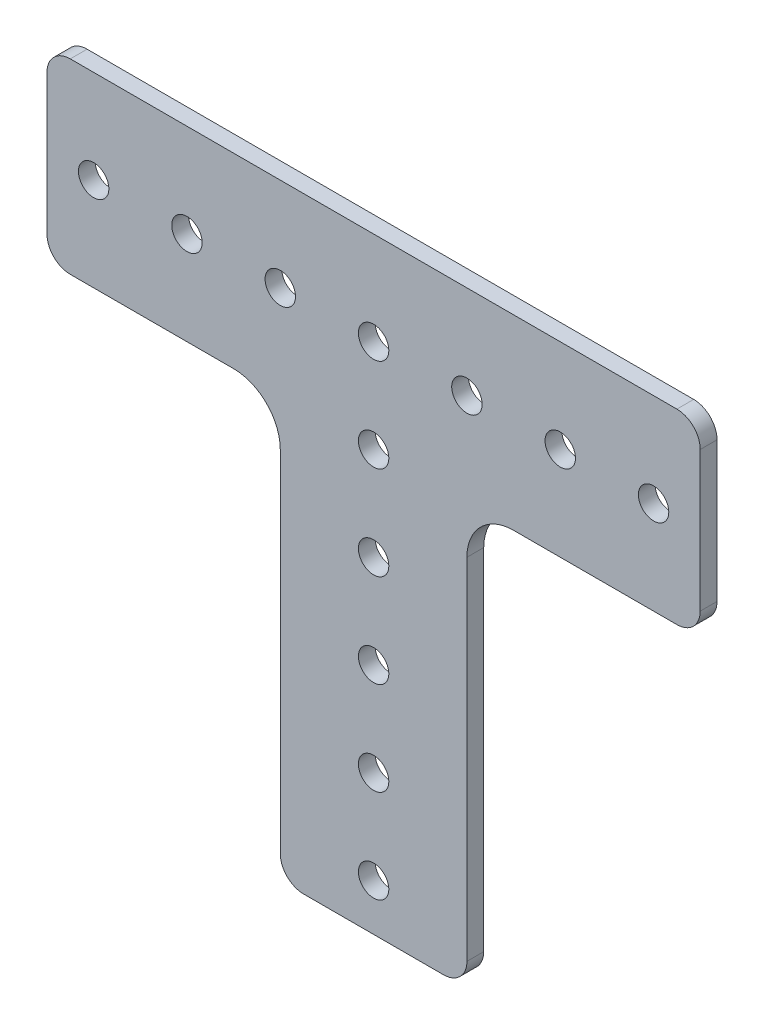
ISO-10303-21;
HEADER;
FILE_DESCRIPTION(('STEP AP214'),'2;1');
FILE_NAME('part.step','',(''),(''),'','','');
FILE_SCHEMA(('AUTOMOTIVE_DESIGN { 1 0 10303 214 1 1 1 1 }'));
ENDSEC;
DATA;
#1=APPLICATION_CONTEXT('core data for automotive mechanical design processes');
#2=APPLICATION_PROTOCOL_DEFINITION('international standard','automotive_design',2000,#1);
#3=PRODUCT_CONTEXT('',#1,'mechanical');
#4=PRODUCT('Part','Part','',(#3));
#5=PRODUCT_RELATED_PRODUCT_CATEGORY('part','',(#4));
#6=PRODUCT_DEFINITION_FORMATION('','',#4);
#7=PRODUCT_DEFINITION_CONTEXT('part definition',#1,'design');
#8=PRODUCT_DEFINITION('design','',#6,#7);
#9=PRODUCT_DEFINITION_SHAPE('','',#8);
#10=(LENGTH_UNIT() NAMED_UNIT(*) SI_UNIT(.MILLI.,.METRE.));
#11=(NAMED_UNIT(*) PLANE_ANGLE_UNIT() SI_UNIT($,.RADIAN.));
#12=(NAMED_UNIT(*) SI_UNIT($,.STERADIAN.) SOLID_ANGLE_UNIT());
#13=UNCERTAINTY_MEASURE_WITH_UNIT(LENGTH_MEASURE(1.E-05),#10,'distance_accuracy_value','');
#14=(GEOMETRIC_REPRESENTATION_CONTEXT(3) GLOBAL_UNCERTAINTY_ASSIGNED_CONTEXT((#13)) GLOBAL_UNIT_ASSIGNED_CONTEXT((#10,
#11,#12)) REPRESENTATION_CONTEXT('',''));
#15=CARTESIAN_POINT('',(0.,0.,0.));
#16=DIRECTION('',(0.,0.,1.));
#17=DIRECTION('',(1.,0.,0.));
#18=AXIS2_PLACEMENT_3D('',#15,#16,#17);
#19=CARTESIAN_POINT('',(42.291,-30.8403654212235,0.));
#20=DIRECTION('',(0.,0.,1.));
#21=DIRECTION('',(1.,0.,0.));
#22=AXIS2_PLACEMENT_3D('',#19,#20,#21);
#23=PLANE('',#22);
#24=DIRECTION('',(1.,0.,0.));
#25=VECTOR('',#24,1.);
#26=CARTESIAN_POINT('',(86.741,0.,0.));
#27=LINE('',#26,#25);
#28=CARTESIAN_POINT('',(83.566,0.,0.));
#29=VERTEX_POINT('',#28);
#30=CARTESIAN_POINT('',(1.01599999999994,0.,0.));
#31=VERTEX_POINT('',#30);
#32=EDGE_CURVE('E132',#29,#31,#27,.F.);
#33=ORIENTED_EDGE('',*,*,#32,.F.);
#34=CARTESIAN_POINT('',(83.566,-3.175,0.));
#35=DIRECTION('',(0.,0.,1.));
#36=DIRECTION('',(1.,0.,0.));
#37=AXIS2_PLACEMENT_3D('',#34,#35,#36);
#38=CIRCLE('',#37,3.175);
#39=CARTESIAN_POINT('',(86.741,-3.175,0.));
#40=VERTEX_POINT('',#39);
#41=EDGE_CURVE('E145',#40,#29,#38,.T.);
#42=ORIENTED_EDGE('',*,*,#41,.F.);
#43=DIRECTION('',(0.,1.,0.));
#44=VECTOR('',#43,1.);
#45=CARTESIAN_POINT('',(86.741,-25.4,0.));
#46=LINE('',#45,#44);
#47=CARTESIAN_POINT('',(86.741,-22.225,0.));
#48=VERTEX_POINT('',#47);
#49=EDGE_CURVE('E157',#48,#40,#46,.T.);
#50=ORIENTED_EDGE('',*,*,#49,.F.);
#51=CARTESIAN_POINT('',(83.566,-22.225,0.));
#52=DIRECTION('',(0.,0.,1.));
#53=DIRECTION('',(1.,0.,0.));
#54=AXIS2_PLACEMENT_3D('',#51,#52,#53);
#55=CIRCLE('',#54,3.175);
#56=CARTESIAN_POINT('',(83.566,-25.4,0.));
#57=VERTEX_POINT('',#56);
#58=EDGE_CURVE('E278',#57,#48,#55,.T.);
#59=ORIENTED_EDGE('',*,*,#58,.F.);
#60=DIRECTION('',(1.,0.,0.));
#61=VECTOR('',#60,1.);
#62=CARTESIAN_POINT('',(61.341,-25.4,0.));
#63=LINE('',#62,#61);
#64=CARTESIAN_POINT('',(61.341,-25.4,0.));
#65=VERTEX_POINT('',#64);
#66=EDGE_CURVE('E161',#65,#57,#63,.T.);
#67=ORIENTED_EDGE('',*,*,#66,.F.);
#68=CARTESIAN_POINT('',(61.341,-31.75,0.));
#69=DIRECTION('',(0.,0.,1.));
#70=DIRECTION('',(1.,0.,0.));
#71=AXIS2_PLACEMENT_3D('',#68,#69,#70);
#72=CIRCLE('',#71,6.35);
#73=CARTESIAN_POINT('',(54.991,-31.75,0.));
#74=VERTEX_POINT('',#73);
#75=EDGE_CURVE('E280',#65,#74,#72,.T.);
#76=ORIENTED_EDGE('',*,*,#75,.T.);
#77=DIRECTION('',(0.,1.,0.));
#78=VECTOR('',#77,1.);
#79=CARTESIAN_POINT('',(54.991,-82.55,0.));
#80=LINE('',#79,#78);
#81=CARTESIAN_POINT('',(54.991,-79.375,0.));
#82=VERTEX_POINT('',#81);
#83=EDGE_CURVE('E165',#82,#74,#80,.T.);
#84=ORIENTED_EDGE('',*,*,#83,.F.);
#85=CARTESIAN_POINT('',(51.816,-79.375,0.));
#86=DIRECTION('',(0.,0.,1.));
#87=DIRECTION('',(1.,0.,0.));
#88=AXIS2_PLACEMENT_3D('',#85,#86,#87);
#89=CIRCLE('',#88,3.175);
#90=CARTESIAN_POINT('',(51.816,-82.55,0.));
#91=VERTEX_POINT('',#90);
#92=EDGE_CURVE('E283',#91,#82,#89,.T.);
#93=ORIENTED_EDGE('',*,*,#92,.F.);
#94=DIRECTION('',(1.,0.,0.));
#95=VECTOR('',#94,1.);
#96=CARTESIAN_POINT('',(29.591,-82.55,0.));
#97=LINE('',#96,#95);
#98=CARTESIAN_POINT('',(32.766,-82.55,0.));
#99=VERTEX_POINT('',#98);
#100=EDGE_CURVE('E169',#99,#91,#97,.T.);
#101=ORIENTED_EDGE('',*,*,#100,.F.);
#102=CARTESIAN_POINT('',(32.766,-79.375,0.));
#103=DIRECTION('',(0.,0.,1.));
#104=DIRECTION('',(1.,0.,0.));
#105=AXIS2_PLACEMENT_3D('',#102,#103,#104);
#106=CIRCLE('',#105,3.175);
#107=CARTESIAN_POINT('',(29.591,-79.375,0.));
#108=VERTEX_POINT('',#107);
#109=EDGE_CURVE('E285',#108,#99,#106,.T.);
#110=ORIENTED_EDGE('',*,*,#109,.F.);
#111=DIRECTION('',(0.,-1.,0.));
#112=VECTOR('',#111,1.);
#113=CARTESIAN_POINT('',(29.591,-31.75,0.));
#114=LINE('',#113,#112);
#115=CARTESIAN_POINT('',(29.591,-31.75,0.));
#116=VERTEX_POINT('',#115);
#117=EDGE_CURVE('E173',#116,#108,#114,.T.);
#118=ORIENTED_EDGE('',*,*,#117,.F.);
#119=CARTESIAN_POINT('',(23.2409999999999,-31.75,0.));
#120=DIRECTION('',(0.,0.,1.));
#121=DIRECTION('',(1.,0.,0.));
#122=AXIS2_PLACEMENT_3D('',#119,#120,#121);
#123=CIRCLE('',#122,6.35);
#124=CARTESIAN_POINT('',(23.2409999999999,-25.4,0.));
#125=VERTEX_POINT('',#124);
#126=EDGE_CURVE('E287',#116,#125,#123,.T.);
#127=ORIENTED_EDGE('',*,*,#126,.T.);
#128=DIRECTION('',(1.,0.,0.));
#129=VECTOR('',#128,1.);
#130=CARTESIAN_POINT('',(-2.15900000000012,-25.4,0.));
#131=LINE('',#130,#129);
#132=CARTESIAN_POINT('',(1.01599999999989,-25.4,0.));
#133=VERTEX_POINT('',#132);
#134=EDGE_CURVE('E177',#133,#125,#131,.T.);
#135=ORIENTED_EDGE('',*,*,#134,.F.);
#136=CARTESIAN_POINT('',(1.01599999999989,-22.225,0.));
#137=DIRECTION('',(0.,0.,1.));
#138=DIRECTION('',(1.,0.,0.));
#139=AXIS2_PLACEMENT_3D('',#136,#137,#138);
#140=CIRCLE('',#139,3.175);
#141=CARTESIAN_POINT('',(-2.15900000000011,-22.225,0.));
#142=VERTEX_POINT('',#141);
#143=EDGE_CURVE('E289',#142,#133,#140,.T.);
#144=ORIENTED_EDGE('',*,*,#143,.F.);
#145=DIRECTION('',(0.,-1.,0.));
#146=VECTOR('',#145,1.);
#147=CARTESIAN_POINT('',(-2.15900000000005,0.,0.));
#148=LINE('',#147,#146);
#149=CARTESIAN_POINT('',(-2.15900000000006,-3.175,0.));
#150=VERTEX_POINT('',#149);
#151=EDGE_CURVE('E134',#150,#142,#148,.T.);
#152=ORIENTED_EDGE('',*,*,#151,.F.);
#153=CARTESIAN_POINT('',(1.01599999999994,-3.175,0.));
#154=DIRECTION('',(0.,0.,1.));
#155=DIRECTION('',(1.,0.,0.));
#156=AXIS2_PLACEMENT_3D('',#153,#154,#155);
#157=CIRCLE('',#156,3.175);
#158=EDGE_CURVE('E20',#31,#150,#157,.T.);
#159=ORIENTED_EDGE('',*,*,#158,.F.);
#160=EDGE_LOOP('',(#33,#42,#50,#59,#67,#76,#84,#93,#101,#110,#118,#127,#135,#144,#152,#159));
#161=FACE_BOUND('',#160,.T.);
#162=CARTESIAN_POINT('',(42.291,-38.1,0.));
#163=DIRECTION('',(0.,0.,1.));
#164=DIRECTION('',(1.,0.,0.));
#165=AXIS2_PLACEMENT_3D('',#162,#163,#164);
#166=CIRCLE('',#165,2.0701);
#167=CARTESIAN_POINT('',(44.3611,-38.1,0.));
#168=VERTEX_POINT('',#167);
#169=EDGE_CURVE('E245',#168,#168,#166,.T.);
#170=ORIENTED_EDGE('',*,*,#169,.T.);
#171=EDGE_LOOP('',(#170));
#172=FACE_BOUND('',#171,.T.);
#173=CARTESIAN_POINT('',(42.291,-50.8,0.));
#174=DIRECTION('',(0.,0.,1.));
#175=DIRECTION('',(1.,0.,0.));
#176=AXIS2_PLACEMENT_3D('',#173,#174,#175);
#177=CIRCLE('',#176,2.0701);
#178=CARTESIAN_POINT('',(44.3611,-50.8,0.));
#179=VERTEX_POINT('',#178);
#180=EDGE_CURVE('E248',#179,#179,#177,.T.);
#181=ORIENTED_EDGE('',*,*,#180,.T.);
#182=EDGE_LOOP('',(#181));
#183=FACE_BOUND('',#182,.T.);
#184=CARTESIAN_POINT('',(42.291,-63.5,0.));
#185=DIRECTION('',(0.,0.,1.));
#186=DIRECTION('',(1.,0.,0.));
#187=AXIS2_PLACEMENT_3D('',#184,#185,#186);
#188=CIRCLE('',#187,2.0701);
#189=CARTESIAN_POINT('',(44.3611,-63.5,0.));
#190=VERTEX_POINT('',#189);
#191=EDGE_CURVE('E251',#190,#190,#188,.T.);
#192=ORIENTED_EDGE('',*,*,#191,.T.);
#193=EDGE_LOOP('',(#192));
#194=FACE_BOUND('',#193,.T.);
#195=CARTESIAN_POINT('',(42.291,-76.2,0.));
#196=DIRECTION('',(0.,0.,1.));
#197=DIRECTION('',(1.,0.,0.));
#198=AXIS2_PLACEMENT_3D('',#195,#196,#197);
#199=CIRCLE('',#198,2.0701);
#200=CARTESIAN_POINT('',(44.3611,-76.2,0.));
#201=VERTEX_POINT('',#200);
#202=EDGE_CURVE('E254',#201,#201,#199,.T.);
#203=ORIENTED_EDGE('',*,*,#202,.T.);
#204=EDGE_LOOP('',(#203));
#205=FACE_BOUND('',#204,.T.);
#206=CARTESIAN_POINT('',(29.591,-12.7,0.));
#207=DIRECTION('',(0.,0.,1.));
#208=DIRECTION('',(1.,0.,0.));
#209=AXIS2_PLACEMENT_3D('',#206,#207,#208);
#210=CIRCLE('',#209,2.0701);
#211=CARTESIAN_POINT('',(31.6611,-12.7,0.));
#212=VERTEX_POINT('',#211);
#213=EDGE_CURVE('E257',#212,#212,#210,.T.);
#214=ORIENTED_EDGE('',*,*,#213,.T.);
#215=EDGE_LOOP('',(#214));
#216=FACE_BOUND('',#215,.T.);
#217=CARTESIAN_POINT('',(16.8909999999999,-12.7,0.));
#218=DIRECTION('',(0.,0.,1.));
#219=DIRECTION('',(1.,0.,0.));
#220=AXIS2_PLACEMENT_3D('',#217,#218,#219);
#221=CIRCLE('',#220,2.0701);
#222=CARTESIAN_POINT('',(18.9610999999999,-12.7,0.));
#223=VERTEX_POINT('',#222);
#224=EDGE_CURVE('E260',#223,#223,#221,.T.);
#225=ORIENTED_EDGE('',*,*,#224,.T.);
#226=EDGE_LOOP('',(#225));
#227=FACE_BOUND('',#226,.T.);
#228=CARTESIAN_POINT('',(4.19099999999995,-12.7,0.));
#229=DIRECTION('',(0.,0.,1.));
#230=DIRECTION('',(1.,0.,0.));
#231=AXIS2_PLACEMENT_3D('',#228,#229,#230);
#232=CIRCLE('',#231,2.0701);
#233=CARTESIAN_POINT('',(6.26109999999995,-12.7,0.));
#234=VERTEX_POINT('',#233);
#235=EDGE_CURVE('E263',#234,#234,#232,.T.);
#236=ORIENTED_EDGE('',*,*,#235,.T.);
#237=EDGE_LOOP('',(#236));
#238=FACE_BOUND('',#237,.T.);
#239=CARTESIAN_POINT('',(42.291,-25.4,0.));
#240=DIRECTION('',(0.,0.,1.));
#241=DIRECTION('',(1.,0.,0.));
#242=AXIS2_PLACEMENT_3D('',#239,#240,#241);
#243=CIRCLE('',#242,2.0701);
#244=CARTESIAN_POINT('',(44.3611,-25.4,0.));
#245=VERTEX_POINT('',#244);
#246=EDGE_CURVE('E266',#245,#245,#243,.T.);
#247=ORIENTED_EDGE('',*,*,#246,.T.);
#248=EDGE_LOOP('',(#247));
#249=FACE_BOUND('',#248,.T.);
#250=CARTESIAN_POINT('',(42.291,-12.7,0.));
#251=DIRECTION('',(0.,0.,1.));
#252=DIRECTION('',(1.,0.,0.));
#253=AXIS2_PLACEMENT_3D('',#250,#251,#252);
#254=CIRCLE('',#253,2.0701);
#255=CARTESIAN_POINT('',(44.3611,-12.7,0.));
#256=VERTEX_POINT('',#255);
#257=EDGE_CURVE('E269',#256,#256,#254,.T.);
#258=ORIENTED_EDGE('',*,*,#257,.T.);
#259=EDGE_LOOP('',(#258));
#260=FACE_BOUND('',#259,.T.);
#261=CARTESIAN_POINT('',(54.991,-12.7,0.));
#262=DIRECTION('',(0.,0.,1.));
#263=DIRECTION('',(1.,0.,0.));
#264=AXIS2_PLACEMENT_3D('',#261,#262,#263);
#265=CIRCLE('',#264,2.0701);
#266=CARTESIAN_POINT('',(57.0611,-12.7,0.));
#267=VERTEX_POINT('',#266);
#268=EDGE_CURVE('E272',#267,#267,#265,.T.);
#269=ORIENTED_EDGE('',*,*,#268,.T.);
#270=EDGE_LOOP('',(#269));
#271=FACE_BOUND('',#270,.T.);
#272=CARTESIAN_POINT('',(67.691,-12.7,0.));
#273=DIRECTION('',(0.,0.,1.));
#274=DIRECTION('',(1.,0.,0.));
#275=AXIS2_PLACEMENT_3D('',#272,#273,#274);
#276=CIRCLE('',#275,2.0701);
#277=CARTESIAN_POINT('',(69.7611,-12.7,0.));
#278=VERTEX_POINT('',#277);
#279=EDGE_CURVE('E151',#278,#278,#276,.T.);
#280=ORIENTED_EDGE('',*,*,#279,.T.);
#281=EDGE_LOOP('',(#280));
#282=FACE_BOUND('',#281,.T.);
#283=CARTESIAN_POINT('',(80.391,-12.7,0.));
#284=DIRECTION('',(0.,0.,1.));
#285=DIRECTION('',(1.,0.,0.));
#286=AXIS2_PLACEMENT_3D('',#283,#284,#285);
#287=CIRCLE('',#286,2.0701);
#288=CARTESIAN_POINT('',(82.4611,-12.7,0.));
#289=VERTEX_POINT('',#288);
#290=EDGE_CURVE('E148',#289,#289,#287,.T.);
#291=ORIENTED_EDGE('',*,*,#290,.T.);
#292=EDGE_LOOP('',(#291));
#293=FACE_BOUND('',#292,.T.);
#294=ADVANCED_FACE('F17',(#161,#172,#183,#194,#205,#216,#227,#238,#249,#260,#271,#282,#293),#23,.F.);
#295=CARTESIAN_POINT('',(1.01599999999994,-3.175,0.));
#296=DIRECTION('',(0.,0.,1.));
#297=DIRECTION('',(1.,0.,0.));
#298=AXIS2_PLACEMENT_3D('',#295,#296,#297);
#299=CYLINDRICAL_SURFACE('',#298,3.175);
#300=ORIENTED_EDGE('',*,*,#158,.T.);
#301=DIRECTION('',(0.,0.,1.));
#302=VECTOR('',#301,1.);
#303=CARTESIAN_POINT('',(-2.15900000000006,-3.175,0.));
#304=LINE('',#303,#302);
#305=CARTESIAN_POINT('',(-2.15900000000006,-3.175,2.286));
#306=VERTEX_POINT('',#305);
#307=EDGE_CURVE('E137',#306,#150,#304,.F.);
#308=ORIENTED_EDGE('',*,*,#307,.F.);
#309=CARTESIAN_POINT('',(1.01599999999994,-3.175,2.286));
#310=DIRECTION('',(0.,0.,1.));
#311=DIRECTION('',(1.,0.,0.));
#312=AXIS2_PLACEMENT_3D('',#309,#310,#311);
#313=CIRCLE('',#312,3.175);
#314=CARTESIAN_POINT('',(1.01599999999994,0.,2.286));
#315=VERTEX_POINT('',#314);
#316=EDGE_CURVE('E142',#315,#306,#313,.T.);
#317=ORIENTED_EDGE('',*,*,#316,.F.);
#318=DIRECTION('',(0.,0.,1.));
#319=VECTOR('',#318,1.);
#320=CARTESIAN_POINT('',(1.01599999999995,0.,0.));
#321=LINE('',#320,#319);
#322=EDGE_CURVE('E139',#31,#315,#321,.T.);
#323=ORIENTED_EDGE('',*,*,#322,.F.);
#324=EDGE_LOOP('',(#300,#308,#317,#323));
#325=FACE_BOUND('',#324,.T.);
#326=ADVANCED_FACE('F140',(#325),#299,.T.);
#327=CARTESIAN_POINT('',(-2.15900000000005,0.,0.));
#328=DIRECTION('',(-1.,0.,0.));
#329=DIRECTION('',(0.,-1.,0.));
#330=AXIS2_PLACEMENT_3D('',#327,#328,#329);
#331=PLANE('',#330);
#332=DIRECTION('',(0.,0.,1.));
#333=VECTOR('',#332,1.);
#334=CARTESIAN_POINT('',(-2.15900000000011,-22.225,0.));
#335=LINE('',#334,#333);
#336=CARTESIAN_POINT('',(-2.15900000000008,-22.225,2.286));
#337=VERTEX_POINT('',#336);
#338=EDGE_CURVE('E181',#337,#142,#335,.F.);
#339=ORIENTED_EDGE('',*,*,#338,.F.);
#340=DIRECTION('',(0.,1.,0.));
#341=VECTOR('',#340,1.);
#342=CARTESIAN_POINT('',(-2.15900000000006,-30.8403654212235,2.286));
#343=LINE('',#342,#341);
#344=EDGE_CURVE('E243',#306,#337,#343,.F.);
#345=ORIENTED_EDGE('',*,*,#344,.F.);
#346=ORIENTED_EDGE('',*,*,#307,.T.);
#347=ORIENTED_EDGE('',*,*,#151,.T.);
#348=EDGE_LOOP('',(#339,#345,#346,#347));
#349=FACE_BOUND('',#348,.T.);
#350=ADVANCED_FACE('F380',(#349),#331,.T.);
#351=CARTESIAN_POINT('',(1.01599999999989,-22.225,0.));
#352=DIRECTION('',(0.,0.,1.));
#353=DIRECTION('',(1.,0.,0.));
#354=AXIS2_PLACEMENT_3D('',#351,#352,#353);
#355=CYLINDRICAL_SURFACE('',#354,3.175);
#356=ORIENTED_EDGE('',*,*,#143,.T.);
#357=DIRECTION('',(0.,0.,1.));
#358=VECTOR('',#357,1.);
#359=CARTESIAN_POINT('',(1.0159999999999,-25.4,0.));
#360=LINE('',#359,#358);
#361=CARTESIAN_POINT('',(1.01599999999989,-25.4,2.286));
#362=VERTEX_POINT('',#361);
#363=EDGE_CURVE('E180',#362,#133,#360,.F.);
#364=ORIENTED_EDGE('',*,*,#363,.F.);
#365=CARTESIAN_POINT('',(1.01599999999989,-22.225,2.286));
#366=DIRECTION('',(0.,0.,1.));
#367=DIRECTION('',(1.,0.,0.));
#368=AXIS2_PLACEMENT_3D('',#365,#366,#367);
#369=CIRCLE('',#368,3.175);
#370=EDGE_CURVE('E240',#337,#362,#369,.T.);
#371=ORIENTED_EDGE('',*,*,#370,.F.);
#372=ORIENTED_EDGE('',*,*,#338,.T.);
#373=EDGE_LOOP('',(#356,#364,#371,#372));
#374=FACE_BOUND('',#373,.T.);
#375=ADVANCED_FACE('F377',(#374),#355,.T.);
#376=CARTESIAN_POINT('',(-2.15900000000012,-25.4,0.));
#377=DIRECTION('',(0.,-1.,0.));
#378=DIRECTION('',(1.,0.,0.));
#379=AXIS2_PLACEMENT_3D('',#376,#377,#378);
#380=PLANE('',#379);
#381=DIRECTION('',(0.,0.,1.));
#382=VECTOR('',#381,1.);
#383=CARTESIAN_POINT('',(23.2409999999999,-25.4,0.));
#384=LINE('',#383,#382);
#385=CARTESIAN_POINT('',(23.2409999999999,-25.4,2.286));
#386=VERTEX_POINT('',#385);
#387=EDGE_CURVE('E179',#125,#386,#384,.T.);
#388=ORIENTED_EDGE('',*,*,#387,.T.);
#389=DIRECTION('',(1.,0.,0.));
#390=VECTOR('',#389,1.);
#391=CARTESIAN_POINT('',(42.291,-25.4,2.286));
#392=LINE('',#391,#390);
#393=EDGE_CURVE('E239',#362,#386,#392,.T.);
#394=ORIENTED_EDGE('',*,*,#393,.F.);
#395=ORIENTED_EDGE('',*,*,#363,.T.);
#396=ORIENTED_EDGE('',*,*,#134,.T.);
#397=EDGE_LOOP('',(#388,#394,#395,#396));
#398=FACE_BOUND('',#397,.T.);
#399=ADVANCED_FACE('F376',(#398),#380,.T.);
#400=CARTESIAN_POINT('',(23.2409999999999,-31.75,0.));
#401=DIRECTION('',(0.,0.,1.));
#402=DIRECTION('',(1.,0.,0.));
#403=AXIS2_PLACEMENT_3D('',#400,#401,#402);
#404=CYLINDRICAL_SURFACE('',#403,6.35);
#405=DIRECTION('',(0.,0.,1.));
#406=VECTOR('',#405,1.);
#407=CARTESIAN_POINT('',(29.591,-31.75,0.));
#408=LINE('',#407,#406);
#409=CARTESIAN_POINT('',(29.591,-31.75,2.286));
#410=VERTEX_POINT('',#409);
#411=EDGE_CURVE('E176',#410,#116,#408,.F.);
#412=ORIENTED_EDGE('',*,*,#411,.F.);
#413=CARTESIAN_POINT('',(23.2409999999999,-31.75,2.286));
#414=DIRECTION('',(0.,0.,1.));
#415=DIRECTION('',(1.,0.,0.));
#416=AXIS2_PLACEMENT_3D('',#413,#414,#415);
#417=CIRCLE('',#416,6.35);
#418=EDGE_CURVE('E236',#386,#410,#417,.F.);
#419=ORIENTED_EDGE('',*,*,#418,.F.);
#420=ORIENTED_EDGE('',*,*,#387,.F.);
#421=ORIENTED_EDGE('',*,*,#126,.F.);
#422=EDGE_LOOP('',(#412,#419,#420,#421));
#423=FACE_BOUND('',#422,.T.);
#424=ADVANCED_FACE('F372',(#423),#404,.F.);
#425=CARTESIAN_POINT('',(29.591,-31.75,0.));
#426=DIRECTION('',(-1.,0.,0.));
#427=DIRECTION('',(0.,-1.,0.));
#428=AXIS2_PLACEMENT_3D('',#425,#426,#427);
#429=PLANE('',#428);
#430=ORIENTED_EDGE('',*,*,#411,.T.);
#431=ORIENTED_EDGE('',*,*,#117,.T.);
#432=DIRECTION('',(0.,0.,1.));
#433=VECTOR('',#432,1.);
#434=CARTESIAN_POINT('',(29.591,-79.375,0.));
#435=LINE('',#434,#433);
#436=CARTESIAN_POINT('',(29.591,-79.375,2.286));
#437=VERTEX_POINT('',#436);
#438=EDGE_CURVE('E175',#437,#108,#435,.F.);
#439=ORIENTED_EDGE('',*,*,#438,.F.);
#440=DIRECTION('',(0.,1.,0.));
#441=VECTOR('',#440,1.);
#442=CARTESIAN_POINT('',(29.591,-30.8403654212235,2.286));
#443=LINE('',#442,#441);
#444=EDGE_CURVE('E235',#410,#437,#443,.F.);
#445=ORIENTED_EDGE('',*,*,#444,.F.);
#446=EDGE_LOOP('',(#430,#431,#439,#445));
#447=FACE_BOUND('',#446,.T.);
#448=ADVANCED_FACE('F369',(#447),#429,.T.);
#449=CARTESIAN_POINT('',(32.766,-79.375,0.));
#450=DIRECTION('',(0.,0.,1.));
#451=DIRECTION('',(1.,0.,0.));
#452=AXIS2_PLACEMENT_3D('',#449,#450,#451);
#453=CYLINDRICAL_SURFACE('',#452,3.175);
#454=ORIENTED_EDGE('',*,*,#109,.T.);
#455=DIRECTION('',(0.,0.,-1.));
#456=VECTOR('',#455,1.);
#457=CARTESIAN_POINT('',(32.766,-82.55,0.));
#458=LINE('',#457,#456);
#459=CARTESIAN_POINT('',(32.766,-82.55,2.286));
#460=VERTEX_POINT('',#459);
#461=EDGE_CURVE('E172',#460,#99,#458,.T.);
#462=ORIENTED_EDGE('',*,*,#461,.F.);
#463=CARTESIAN_POINT('',(32.766,-79.375,2.286));
#464=DIRECTION('',(0.,0.,1.));
#465=DIRECTION('',(1.,0.,0.));
#466=AXIS2_PLACEMENT_3D('',#463,#464,#465);
#467=CIRCLE('',#466,3.175);
#468=EDGE_CURVE('E232',#437,#460,#467,.T.);
#469=ORIENTED_EDGE('',*,*,#468,.F.);
#470=ORIENTED_EDGE('',*,*,#438,.T.);
#471=EDGE_LOOP('',(#454,#462,#469,#470));
#472=FACE_BOUND('',#471,.T.);
#473=ADVANCED_FACE('F366',(#472),#453,.T.);
#474=CARTESIAN_POINT('',(29.591,-82.55,0.));
#475=DIRECTION('',(0.,-1.,0.));
#476=DIRECTION('',(0.,0.,-1.));
#477=AXIS2_PLACEMENT_3D('',#474,#475,#476);
#478=PLANE('',#477);
#479=DIRECTION('',(0.,0.,1.));
#480=VECTOR('',#479,1.);
#481=CARTESIAN_POINT('',(51.816,-82.55,0.));
#482=LINE('',#481,#480);
#483=CARTESIAN_POINT('',(51.816,-82.55,2.286));
#484=VERTEX_POINT('',#483);
#485=EDGE_CURVE('E171',#484,#91,#482,.F.);
#486=ORIENTED_EDGE('',*,*,#485,.F.);
#487=DIRECTION('',(1.,0.,0.));
#488=VECTOR('',#487,1.);
#489=CARTESIAN_POINT('',(42.291,-82.55,2.286));
#490=LINE('',#489,#488);
#491=EDGE_CURVE('E231',#460,#484,#490,.T.);
#492=ORIENTED_EDGE('',*,*,#491,.F.);
#493=ORIENTED_EDGE('',*,*,#461,.T.);
#494=ORIENTED_EDGE('',*,*,#100,.T.);
#495=EDGE_LOOP('',(#486,#492,#493,#494));
#496=FACE_BOUND('',#495,.T.);
#497=ADVANCED_FACE('F361',(#496),#478,.T.);
#498=CARTESIAN_POINT('',(51.816,-79.375,0.));
#499=DIRECTION('',(0.,0.,1.));
#500=DIRECTION('',(1.,0.,0.));
#501=AXIS2_PLACEMENT_3D('',#498,#499,#500);
#502=CYLINDRICAL_SURFACE('',#501,3.175);
#503=ORIENTED_EDGE('',*,*,#92,.T.);
#504=DIRECTION('',(0.,0.,1.));
#505=VECTOR('',#504,1.);
#506=CARTESIAN_POINT('',(54.991,-79.375,0.));
#507=LINE('',#506,#505);
#508=CARTESIAN_POINT('',(54.991,-79.375,2.286));
#509=VERTEX_POINT('',#508);
#510=EDGE_CURVE('E168',#509,#82,#507,.F.);
#511=ORIENTED_EDGE('',*,*,#510,.F.);
#512=CARTESIAN_POINT('',(51.816,-79.375,2.286));
#513=DIRECTION('',(0.,0.,1.));
#514=DIRECTION('',(1.,0.,0.));
#515=AXIS2_PLACEMENT_3D('',#512,#513,#514);
#516=CIRCLE('',#515,3.175);
#517=EDGE_CURVE('E228',#484,#509,#516,.T.);
#518=ORIENTED_EDGE('',*,*,#517,.F.);
#519=ORIENTED_EDGE('',*,*,#485,.T.);
#520=EDGE_LOOP('',(#503,#511,#518,#519));
#521=FACE_BOUND('',#520,.T.);
#522=ADVANCED_FACE('F358',(#521),#502,.T.);
#523=CARTESIAN_POINT('',(54.991,-82.55,0.));
#524=DIRECTION('',(1.,0.,0.));
#525=DIRECTION('',(0.,1.,0.));
#526=AXIS2_PLACEMENT_3D('',#523,#524,#525);
#527=PLANE('',#526);
#528=DIRECTION('',(0.,0.,1.));
#529=VECTOR('',#528,1.);
#530=CARTESIAN_POINT('',(54.991,-31.75,0.));
#531=LINE('',#530,#529);
#532=CARTESIAN_POINT('',(54.991,-31.75,2.286));
#533=VERTEX_POINT('',#532);
#534=EDGE_CURVE('E167',#74,#533,#531,.T.);
#535=ORIENTED_EDGE('',*,*,#534,.T.);
#536=DIRECTION('',(0.,1.,0.));
#537=VECTOR('',#536,1.);
#538=CARTESIAN_POINT('',(54.991,-30.8403654212235,2.286));
#539=LINE('',#538,#537);
#540=EDGE_CURVE('E227',#509,#533,#539,.T.);
#541=ORIENTED_EDGE('',*,*,#540,.F.);
#542=ORIENTED_EDGE('',*,*,#510,.T.);
#543=ORIENTED_EDGE('',*,*,#83,.T.);
#544=EDGE_LOOP('',(#535,#541,#542,#543));
#545=FACE_BOUND('',#544,.T.);
#546=ADVANCED_FACE('F355',(#545),#527,.T.);
#547=CARTESIAN_POINT('',(61.341,-31.75,0.));
#548=DIRECTION('',(0.,0.,1.));
#549=DIRECTION('',(1.,0.,0.));
#550=AXIS2_PLACEMENT_3D('',#547,#548,#549);
#551=CYLINDRICAL_SURFACE('',#550,6.35);
#552=DIRECTION('',(0.,0.,1.));
#553=VECTOR('',#552,1.);
#554=CARTESIAN_POINT('',(61.341,-25.4,0.));
#555=LINE('',#554,#553);
#556=CARTESIAN_POINT('',(61.341,-25.4,2.286));
#557=VERTEX_POINT('',#556);
#558=EDGE_CURVE('E164',#557,#65,#555,.F.);
#559=ORIENTED_EDGE('',*,*,#558,.F.);
#560=CARTESIAN_POINT('',(61.341,-31.75,2.286));
#561=DIRECTION('',(0.,0.,1.));
#562=DIRECTION('',(1.,0.,0.));
#563=AXIS2_PLACEMENT_3D('',#560,#561,#562);
#564=CIRCLE('',#563,6.35);
#565=EDGE_CURVE('E224',#533,#557,#564,.F.);
#566=ORIENTED_EDGE('',*,*,#565,.F.);
#567=ORIENTED_EDGE('',*,*,#534,.F.);
#568=ORIENTED_EDGE('',*,*,#75,.F.);
#569=EDGE_LOOP('',(#559,#566,#567,#568));
#570=FACE_BOUND('',#569,.T.);
#571=ADVANCED_FACE('F348',(#570),#551,.F.);
#572=CARTESIAN_POINT('',(61.341,-25.4,0.));
#573=DIRECTION('',(0.,-1.,0.));
#574=DIRECTION('',(1.,0.,0.));
#575=AXIS2_PLACEMENT_3D('',#572,#573,#574);
#576=PLANE('',#575);
#577=ORIENTED_EDGE('',*,*,#558,.T.);
#578=ORIENTED_EDGE('',*,*,#66,.T.);
#579=DIRECTION('',(0.,0.,1.));
#580=VECTOR('',#579,1.);
#581=CARTESIAN_POINT('',(83.566,-25.4,0.));
#582=LINE('',#581,#580);
#583=CARTESIAN_POINT('',(83.566,-25.4,2.286));
#584=VERTEX_POINT('',#583);
#585=EDGE_CURVE('E163',#584,#57,#582,.F.);
#586=ORIENTED_EDGE('',*,*,#585,.F.);
#587=DIRECTION('',(1.,0.,0.));
#588=VECTOR('',#587,1.);
#589=CARTESIAN_POINT('',(42.291,-25.4,2.286));
#590=LINE('',#589,#588);
#591=EDGE_CURVE('E223',#557,#584,#590,.T.);
#592=ORIENTED_EDGE('',*,*,#591,.F.);
#593=EDGE_LOOP('',(#577,#578,#586,#592));
#594=FACE_BOUND('',#593,.T.);
#595=ADVANCED_FACE('F345',(#594),#576,.T.);
#596=CARTESIAN_POINT('',(83.566,-22.225,0.));
#597=DIRECTION('',(0.,0.,1.));
#598=DIRECTION('',(1.,0.,0.));
#599=AXIS2_PLACEMENT_3D('',#596,#597,#598);
#600=CYLINDRICAL_SURFACE('',#599,3.175);
#601=ORIENTED_EDGE('',*,*,#58,.T.);
#602=DIRECTION('',(0.,0.,1.));
#603=VECTOR('',#602,1.);
#604=CARTESIAN_POINT('',(86.741,-22.225,0.));
#605=LINE('',#604,#603);
#606=CARTESIAN_POINT('',(86.741,-22.225,2.286));
#607=VERTEX_POINT('',#606);
#608=EDGE_CURVE('E160',#607,#48,#605,.F.);
#609=ORIENTED_EDGE('',*,*,#608,.F.);
#610=CARTESIAN_POINT('',(83.566,-22.225,2.286));
#611=DIRECTION('',(0.,0.,1.));
#612=DIRECTION('',(1.,0.,0.));
#613=AXIS2_PLACEMENT_3D('',#610,#611,#612);
#614=CIRCLE('',#613,3.175);
#615=EDGE_CURVE('E220',#584,#607,#614,.T.);
#616=ORIENTED_EDGE('',*,*,#615,.F.);
#617=ORIENTED_EDGE('',*,*,#585,.T.);
#618=EDGE_LOOP('',(#601,#609,#616,#617));
#619=FACE_BOUND('',#618,.T.);
#620=ADVANCED_FACE('F342',(#619),#600,.T.);
#621=CARTESIAN_POINT('',(86.741,-25.4,0.));
#622=DIRECTION('',(1.,0.,0.));
#623=DIRECTION('',(0.,1.,0.));
#624=AXIS2_PLACEMENT_3D('',#621,#622,#623);
#625=PLANE('',#624);
#626=DIRECTION('',(0.,0.,1.));
#627=VECTOR('',#626,1.);
#628=CARTESIAN_POINT('',(86.741,-3.175,0.));
#629=LINE('',#628,#627);
#630=CARTESIAN_POINT('',(86.741,-3.175,2.286));
#631=VERTEX_POINT('',#630);
#632=EDGE_CURVE('E159',#631,#40,#629,.F.);
#633=ORIENTED_EDGE('',*,*,#632,.F.);
#634=DIRECTION('',(0.,1.,0.));
#635=VECTOR('',#634,1.);
#636=CARTESIAN_POINT('',(86.741,-30.8403654212235,2.286));
#637=LINE('',#636,#635);
#638=EDGE_CURVE('E219',#607,#631,#637,.T.);
#639=ORIENTED_EDGE('',*,*,#638,.F.);
#640=ORIENTED_EDGE('',*,*,#608,.T.);
#641=ORIENTED_EDGE('',*,*,#49,.T.);
#642=EDGE_LOOP('',(#633,#639,#640,#641));
#643=FACE_BOUND('',#642,.T.);
#644=ADVANCED_FACE('F336',(#643),#625,.T.);
#645=CARTESIAN_POINT('',(83.566,-3.175,0.));
#646=DIRECTION('',(0.,0.,1.));
#647=DIRECTION('',(1.,0.,0.));
#648=AXIS2_PLACEMENT_3D('',#645,#646,#647);
#649=CYLINDRICAL_SURFACE('',#648,3.175);
#650=ORIENTED_EDGE('',*,*,#41,.T.);
#651=DIRECTION('',(0.,0.,1.));
#652=VECTOR('',#651,1.);
#653=CARTESIAN_POINT('',(83.566,0.,0.));
#654=LINE('',#653,#652);
#655=CARTESIAN_POINT('',(83.566,0.,2.286));
#656=VERTEX_POINT('',#655);
#657=EDGE_CURVE('E35',#656,#29,#654,.F.);
#658=ORIENTED_EDGE('',*,*,#657,.F.);
#659=CARTESIAN_POINT('',(83.566,-3.175,2.286));
#660=DIRECTION('',(0.,0.,1.));
#661=DIRECTION('',(1.,0.,0.));
#662=AXIS2_PLACEMENT_3D('',#659,#660,#661);
#663=CIRCLE('',#662,3.175);
#664=EDGE_CURVE('E216',#631,#656,#663,.T.);
#665=ORIENTED_EDGE('',*,*,#664,.F.);
#666=ORIENTED_EDGE('',*,*,#632,.T.);
#667=EDGE_LOOP('',(#650,#658,#665,#666));
#668=FACE_BOUND('',#667,.T.);
#669=ADVANCED_FACE('F334',(#668),#649,.T.);
#670=CARTESIAN_POINT('',(86.741,0.,0.));
#671=DIRECTION('',(0.,1.,0.));
#672=DIRECTION('',(0.,0.,1.));
#673=AXIS2_PLACEMENT_3D('',#670,#671,#672);
#674=PLANE('',#673);
#675=ORIENTED_EDGE('',*,*,#657,.T.);
#676=ORIENTED_EDGE('',*,*,#32,.T.);
#677=ORIENTED_EDGE('',*,*,#322,.T.);
#678=DIRECTION('',(1.,0.,0.));
#679=VECTOR('',#678,1.);
#680=CARTESIAN_POINT('',(42.291,0.,2.286));
#681=LINE('',#680,#679);
#682=EDGE_CURVE('E215',#656,#315,#681,.F.);
#683=ORIENTED_EDGE('',*,*,#682,.F.);
#684=EDGE_LOOP('',(#675,#676,#677,#683));
#685=FACE_BOUND('',#684,.T.);
#686=ADVANCED_FACE('F147',(#685),#674,.T.);
#687=CARTESIAN_POINT('',(80.391,-12.7,0.));
#688=DIRECTION('',(0.,0.,1.));
#689=DIRECTION('',(1.,0.,0.));
#690=AXIS2_PLACEMENT_3D('',#687,#688,#689);
#691=CYLINDRICAL_SURFACE('',#690,2.0701);
#692=ORIENTED_EDGE('',*,*,#290,.F.);
#693=EDGE_LOOP('',(#692));
#694=FACE_BOUND('',#693,.T.);
#695=CARTESIAN_POINT('',(80.391,-12.7,2.286));
#696=DIRECTION('',(0.,0.,1.));
#697=DIRECTION('',(1.,0.,0.));
#698=AXIS2_PLACEMENT_3D('',#695,#696,#697);
#699=CIRCLE('',#698,2.0701);
#700=CARTESIAN_POINT('',(82.4611,-12.7,2.286));
#701=VERTEX_POINT('',#700);
#702=EDGE_CURVE('E212',#701,#701,#699,.F.);
#703=ORIENTED_EDGE('',*,*,#702,.F.);
#704=EDGE_LOOP('',(#703));
#705=FACE_BOUND('',#704,.T.);
#706=ADVANCED_FACE('F439',(#694,#705),#691,.F.);
#707=CARTESIAN_POINT('',(67.691,-12.7,0.));
#708=DIRECTION('',(0.,0.,1.));
#709=DIRECTION('',(1.,0.,0.));
#710=AXIS2_PLACEMENT_3D('',#707,#708,#709);
#711=CYLINDRICAL_SURFACE('',#710,2.0701);
#712=ORIENTED_EDGE('',*,*,#279,.F.);
#713=EDGE_LOOP('',(#712));
#714=FACE_BOUND('',#713,.T.);
#715=CARTESIAN_POINT('',(67.691,-12.7,2.286));
#716=DIRECTION('',(0.,0.,1.));
#717=DIRECTION('',(1.,0.,0.));
#718=AXIS2_PLACEMENT_3D('',#715,#716,#717);
#719=CIRCLE('',#718,2.0701);
#720=CARTESIAN_POINT('',(69.7611,-12.7,2.286));
#721=VERTEX_POINT('',#720);
#722=EDGE_CURVE('E209',#721,#721,#719,.F.);
#723=ORIENTED_EDGE('',*,*,#722,.F.);
#724=EDGE_LOOP('',(#723));
#725=FACE_BOUND('',#724,.T.);
#726=ADVANCED_FACE('F435',(#714,#725),#711,.F.);
#727=CARTESIAN_POINT('',(54.991,-12.7,0.));
#728=DIRECTION('',(0.,0.,1.));
#729=DIRECTION('',(1.,0.,0.));
#730=AXIS2_PLACEMENT_3D('',#727,#728,#729);
#731=CYLINDRICAL_SURFACE('',#730,2.0701);
#732=ORIENTED_EDGE('',*,*,#268,.F.);
#733=EDGE_LOOP('',(#732));
#734=FACE_BOUND('',#733,.T.);
#735=CARTESIAN_POINT('',(54.991,-12.7,2.286));
#736=DIRECTION('',(0.,0.,1.));
#737=DIRECTION('',(1.,0.,0.));
#738=AXIS2_PLACEMENT_3D('',#735,#736,#737);
#739=CIRCLE('',#738,2.0701);
#740=CARTESIAN_POINT('',(57.0611,-12.7,2.286));
#741=VERTEX_POINT('',#740);
#742=EDGE_CURVE('E206',#741,#741,#739,.F.);
#743=ORIENTED_EDGE('',*,*,#742,.F.);
#744=EDGE_LOOP('',(#743));
#745=FACE_BOUND('',#744,.T.);
#746=ADVANCED_FACE('F431',(#734,#745),#731,.F.);
#747=CARTESIAN_POINT('',(42.291,-12.7,0.));
#748=DIRECTION('',(0.,0.,1.));
#749=DIRECTION('',(1.,0.,0.));
#750=AXIS2_PLACEMENT_3D('',#747,#748,#749);
#751=CYLINDRICAL_SURFACE('',#750,2.0701);
#752=ORIENTED_EDGE('',*,*,#257,.F.);
#753=EDGE_LOOP('',(#752));
#754=FACE_BOUND('',#753,.T.);
#755=CARTESIAN_POINT('',(42.291,-12.7,2.286));
#756=DIRECTION('',(0.,0.,1.));
#757=DIRECTION('',(1.,0.,0.));
#758=AXIS2_PLACEMENT_3D('',#755,#756,#757);
#759=CIRCLE('',#758,2.0701);
#760=CARTESIAN_POINT('',(44.3611,-12.7,2.286));
#761=VERTEX_POINT('',#760);
#762=EDGE_CURVE('E203',#761,#761,#759,.F.);
#763=ORIENTED_EDGE('',*,*,#762,.F.);
#764=EDGE_LOOP('',(#763));
#765=FACE_BOUND('',#764,.T.);
#766=ADVANCED_FACE('F427',(#754,#765),#751,.F.);
#767=CARTESIAN_POINT('',(42.291,-25.4,0.));
#768=DIRECTION('',(0.,0.,1.));
#769=DIRECTION('',(1.,0.,0.));
#770=AXIS2_PLACEMENT_3D('',#767,#768,#769);
#771=CYLINDRICAL_SURFACE('',#770,2.0701);
#772=ORIENTED_EDGE('',*,*,#246,.F.);
#773=EDGE_LOOP('',(#772));
#774=FACE_BOUND('',#773,.T.);
#775=CARTESIAN_POINT('',(42.291,-25.4,2.286));
#776=DIRECTION('',(0.,0.,1.));
#777=DIRECTION('',(1.,0.,0.));
#778=AXIS2_PLACEMENT_3D('',#775,#776,#777);
#779=CIRCLE('',#778,2.0701);
#780=CARTESIAN_POINT('',(44.3611,-25.4,2.286));
#781=VERTEX_POINT('',#780);
#782=EDGE_CURVE('E200',#781,#781,#779,.F.);
#783=ORIENTED_EDGE('',*,*,#782,.F.);
#784=EDGE_LOOP('',(#783));
#785=FACE_BOUND('',#784,.T.);
#786=ADVANCED_FACE('F423',(#774,#785),#771,.F.);
#787=CARTESIAN_POINT('',(4.19099999999995,-12.7,0.));
#788=DIRECTION('',(0.,0.,1.));
#789=DIRECTION('',(1.,0.,0.));
#790=AXIS2_PLACEMENT_3D('',#787,#788,#789);
#791=CYLINDRICAL_SURFACE('',#790,2.0701);
#792=ORIENTED_EDGE('',*,*,#235,.F.);
#793=EDGE_LOOP('',(#792));
#794=FACE_BOUND('',#793,.T.);
#795=CARTESIAN_POINT('',(4.19099999999995,-12.7,2.286));
#796=DIRECTION('',(0.,0.,1.));
#797=DIRECTION('',(1.,0.,0.));
#798=AXIS2_PLACEMENT_3D('',#795,#796,#797);
#799=CIRCLE('',#798,2.0701);
#800=CARTESIAN_POINT('',(6.26109999999995,-12.7,2.286));
#801=VERTEX_POINT('',#800);
#802=EDGE_CURVE('E197',#801,#801,#799,.F.);
#803=ORIENTED_EDGE('',*,*,#802,.F.);
#804=EDGE_LOOP('',(#803));
#805=FACE_BOUND('',#804,.T.);
#806=ADVANCED_FACE('F419',(#794,#805),#791,.F.);
#807=CARTESIAN_POINT('',(16.8909999999999,-12.7,0.));
#808=DIRECTION('',(0.,0.,1.));
#809=DIRECTION('',(1.,0.,0.));
#810=AXIS2_PLACEMENT_3D('',#807,#808,#809);
#811=CYLINDRICAL_SURFACE('',#810,2.0701);
#812=ORIENTED_EDGE('',*,*,#224,.F.);
#813=EDGE_LOOP('',(#812));
#814=FACE_BOUND('',#813,.T.);
#815=CARTESIAN_POINT('',(16.8909999999999,-12.7,2.286));
#816=DIRECTION('',(0.,0.,1.));
#817=DIRECTION('',(1.,0.,0.));
#818=AXIS2_PLACEMENT_3D('',#815,#816,#817);
#819=CIRCLE('',#818,2.0701);
#820=CARTESIAN_POINT('',(18.9610999999999,-12.7,2.286));
#821=VERTEX_POINT('',#820);
#822=EDGE_CURVE('E194',#821,#821,#819,.F.);
#823=ORIENTED_EDGE('',*,*,#822,.F.);
#824=EDGE_LOOP('',(#823));
#825=FACE_BOUND('',#824,.T.);
#826=ADVANCED_FACE('F415',(#814,#825),#811,.F.);
#827=CARTESIAN_POINT('',(29.591,-12.7,0.));
#828=DIRECTION('',(0.,0.,1.));
#829=DIRECTION('',(1.,0.,0.));
#830=AXIS2_PLACEMENT_3D('',#827,#828,#829);
#831=CYLINDRICAL_SURFACE('',#830,2.0701);
#832=ORIENTED_EDGE('',*,*,#213,.F.);
#833=EDGE_LOOP('',(#832));
#834=FACE_BOUND('',#833,.T.);
#835=CARTESIAN_POINT('',(29.591,-12.7,2.286));
#836=DIRECTION('',(0.,0.,1.));
#837=DIRECTION('',(1.,0.,0.));
#838=AXIS2_PLACEMENT_3D('',#835,#836,#837);
#839=CIRCLE('',#838,2.0701);
#840=CARTESIAN_POINT('',(31.6611,-12.7,2.286));
#841=VERTEX_POINT('',#840);
#842=EDGE_CURVE('E191',#841,#841,#839,.F.);
#843=ORIENTED_EDGE('',*,*,#842,.F.);
#844=EDGE_LOOP('',(#843));
#845=FACE_BOUND('',#844,.T.);
#846=ADVANCED_FACE('F411',(#834,#845),#831,.F.);
#847=CARTESIAN_POINT('',(42.291,-76.2,0.));
#848=DIRECTION('',(0.,0.,1.));
#849=DIRECTION('',(1.,0.,0.));
#850=AXIS2_PLACEMENT_3D('',#847,#848,#849);
#851=CYLINDRICAL_SURFACE('',#850,2.0701);
#852=ORIENTED_EDGE('',*,*,#202,.F.);
#853=EDGE_LOOP('',(#852));
#854=FACE_BOUND('',#853,.T.);
#855=CARTESIAN_POINT('',(42.291,-76.2,2.286));
#856=DIRECTION('',(0.,0.,1.));
#857=DIRECTION('',(1.,0.,0.));
#858=AXIS2_PLACEMENT_3D('',#855,#856,#857);
#859=CIRCLE('',#858,2.0701);
#860=CARTESIAN_POINT('',(44.3611,-76.2,2.286));
#861=VERTEX_POINT('',#860);
#862=EDGE_CURVE('E188',#861,#861,#859,.F.);
#863=ORIENTED_EDGE('',*,*,#862,.F.);
#864=EDGE_LOOP('',(#863));
#865=FACE_BOUND('',#864,.T.);
#866=ADVANCED_FACE('F407',(#854,#865),#851,.F.);
#867=CARTESIAN_POINT('',(42.291,-63.5,0.));
#868=DIRECTION('',(0.,0.,1.));
#869=DIRECTION('',(1.,0.,0.));
#870=AXIS2_PLACEMENT_3D('',#867,#868,#869);
#871=CYLINDRICAL_SURFACE('',#870,2.0701);
#872=ORIENTED_EDGE('',*,*,#191,.F.);
#873=EDGE_LOOP('',(#872));
#874=FACE_BOUND('',#873,.T.);
#875=CARTESIAN_POINT('',(42.291,-63.5,2.286));
#876=DIRECTION('',(0.,0.,1.));
#877=DIRECTION('',(1.,0.,0.));
#878=AXIS2_PLACEMENT_3D('',#875,#876,#877);
#879=CIRCLE('',#878,2.0701);
#880=CARTESIAN_POINT('',(44.3611,-63.5,2.286));
#881=VERTEX_POINT('',#880);
#882=EDGE_CURVE('E185',#881,#881,#879,.F.);
#883=ORIENTED_EDGE('',*,*,#882,.F.);
#884=EDGE_LOOP('',(#883));
#885=FACE_BOUND('',#884,.T.);
#886=ADVANCED_FACE('F403',(#874,#885),#871,.F.);
#887=CARTESIAN_POINT('',(42.291,-50.8,0.));
#888=DIRECTION('',(0.,0.,1.));
#889=DIRECTION('',(1.,0.,0.));
#890=AXIS2_PLACEMENT_3D('',#887,#888,#889);
#891=CYLINDRICAL_SURFACE('',#890,2.0701);
#892=ORIENTED_EDGE('',*,*,#180,.F.);
#893=EDGE_LOOP('',(#892));
#894=FACE_BOUND('',#893,.T.);
#895=CARTESIAN_POINT('',(42.291,-50.8,2.286));
#896=DIRECTION('',(0.,0.,1.));
#897=DIRECTION('',(1.,0.,0.));
#898=AXIS2_PLACEMENT_3D('',#895,#896,#897);
#899=CIRCLE('',#898,2.0701);
#900=CARTESIAN_POINT('',(44.3611,-50.8,2.286));
#901=VERTEX_POINT('',#900);
#902=EDGE_CURVE('E26',#901,#901,#899,.F.);
#903=ORIENTED_EDGE('',*,*,#902,.F.);
#904=EDGE_LOOP('',(#903));
#905=FACE_BOUND('',#904,.T.);
#906=ADVANCED_FACE('F396',(#894,#905),#891,.F.);
#907=CARTESIAN_POINT('',(42.291,-38.1,0.));
#908=DIRECTION('',(0.,0.,1.));
#909=DIRECTION('',(1.,0.,0.));
#910=AXIS2_PLACEMENT_3D('',#907,#908,#909);
#911=CYLINDRICAL_SURFACE('',#910,2.0701);
#912=ORIENTED_EDGE('',*,*,#169,.F.);
#913=EDGE_LOOP('',(#912));
#914=FACE_BOUND('',#913,.T.);
#915=CARTESIAN_POINT('',(42.291,-38.1,2.286));
#916=DIRECTION('',(0.,0.,1.));
#917=DIRECTION('',(1.,0.,0.));
#918=AXIS2_PLACEMENT_3D('',#915,#916,#917);
#919=CIRCLE('',#918,2.0701);
#920=CARTESIAN_POINT('',(44.3611,-38.1,2.286));
#921=VERTEX_POINT('',#920);
#922=EDGE_CURVE('E11',#921,#921,#919,.F.);
#923=ORIENTED_EDGE('',*,*,#922,.F.);
#924=EDGE_LOOP('',(#923));
#925=FACE_BOUND('',#924,.T.);
#926=ADVANCED_FACE('F390',(#914,#925),#911,.F.);
#927=CARTESIAN_POINT('',(42.291,-30.8403654212235,2.286));
#928=DIRECTION('',(0.,0.,1.));
#929=DIRECTION('',(1.,0.,0.));
#930=AXIS2_PLACEMENT_3D('',#927,#928,#929);
#931=PLANE('',#930);
#932=ORIENTED_EDGE('',*,*,#922,.T.);
#933=EDGE_LOOP('',(#932));
#934=FACE_BOUND('',#933,.T.);
#935=ORIENTED_EDGE('',*,*,#902,.T.);
#936=EDGE_LOOP('',(#935));
#937=FACE_BOUND('',#936,.T.);
#938=ORIENTED_EDGE('',*,*,#882,.T.);
#939=EDGE_LOOP('',(#938));
#940=FACE_BOUND('',#939,.T.);
#941=ORIENTED_EDGE('',*,*,#862,.T.);
#942=EDGE_LOOP('',(#941));
#943=FACE_BOUND('',#942,.T.);
#944=ORIENTED_EDGE('',*,*,#842,.T.);
#945=EDGE_LOOP('',(#944));
#946=FACE_BOUND('',#945,.T.);
#947=ORIENTED_EDGE('',*,*,#822,.T.);
#948=EDGE_LOOP('',(#947));
#949=FACE_BOUND('',#948,.T.);
#950=ORIENTED_EDGE('',*,*,#802,.T.);
#951=EDGE_LOOP('',(#950));
#952=FACE_BOUND('',#951,.T.);
#953=ORIENTED_EDGE('',*,*,#782,.T.);
#954=EDGE_LOOP('',(#953));
#955=FACE_BOUND('',#954,.T.);
#956=ORIENTED_EDGE('',*,*,#762,.T.);
#957=EDGE_LOOP('',(#956));
#958=FACE_BOUND('',#957,.T.);
#959=ORIENTED_EDGE('',*,*,#742,.T.);
#960=EDGE_LOOP('',(#959));
#961=FACE_BOUND('',#960,.T.);
#962=ORIENTED_EDGE('',*,*,#722,.T.);
#963=EDGE_LOOP('',(#962));
#964=FACE_BOUND('',#963,.T.);
#965=ORIENTED_EDGE('',*,*,#702,.T.);
#966=EDGE_LOOP('',(#965));
#967=FACE_BOUND('',#966,.T.);
#968=ORIENTED_EDGE('',*,*,#664,.T.);
#969=ORIENTED_EDGE('',*,*,#682,.T.);
#970=ORIENTED_EDGE('',*,*,#316,.T.);
#971=ORIENTED_EDGE('',*,*,#344,.T.);
#972=ORIENTED_EDGE('',*,*,#370,.T.);
#973=ORIENTED_EDGE('',*,*,#393,.T.);
#974=ORIENTED_EDGE('',*,*,#418,.T.);
#975=ORIENTED_EDGE('',*,*,#444,.T.);
#976=ORIENTED_EDGE('',*,*,#468,.T.);
#977=ORIENTED_EDGE('',*,*,#491,.T.);
#978=ORIENTED_EDGE('',*,*,#517,.T.);
#979=ORIENTED_EDGE('',*,*,#540,.T.);
#980=ORIENTED_EDGE('',*,*,#565,.T.);
#981=ORIENTED_EDGE('',*,*,#591,.T.);
#982=ORIENTED_EDGE('',*,*,#615,.T.);
#983=ORIENTED_EDGE('',*,*,#638,.T.);
#984=EDGE_LOOP('',(#968,#969,#970,#971,#972,#973,#974,#975,#976,#977,#978,#979,#980,#981,#982,#983));
#985=FACE_BOUND('',#984,.T.);
#986=ADVANCED_FACE('F332',(#934,#937,#940,#943,#946,#949,#952,#955,#958,#961,#964,#967,#985),
#931,.T.);
#987=CLOSED_SHELL('',(#294,#326,#350,#375,#399,#424,#448,#473,#497,#522,#546,#571,#595,#620,
#644,#669,#686,#706,#726,#746,#766,#786,#806,#826,#846,#866,#886,#906,#926,#986));
#988=MANIFOLD_SOLID_BREP('B1',#987);
#989=ADVANCED_BREP_SHAPE_REPRESENTATION('',(#18,#988),#14);
#990=SHAPE_DEFINITION_REPRESENTATION(#9,#989);
ENDSEC;
END-ISO-10303-21;
